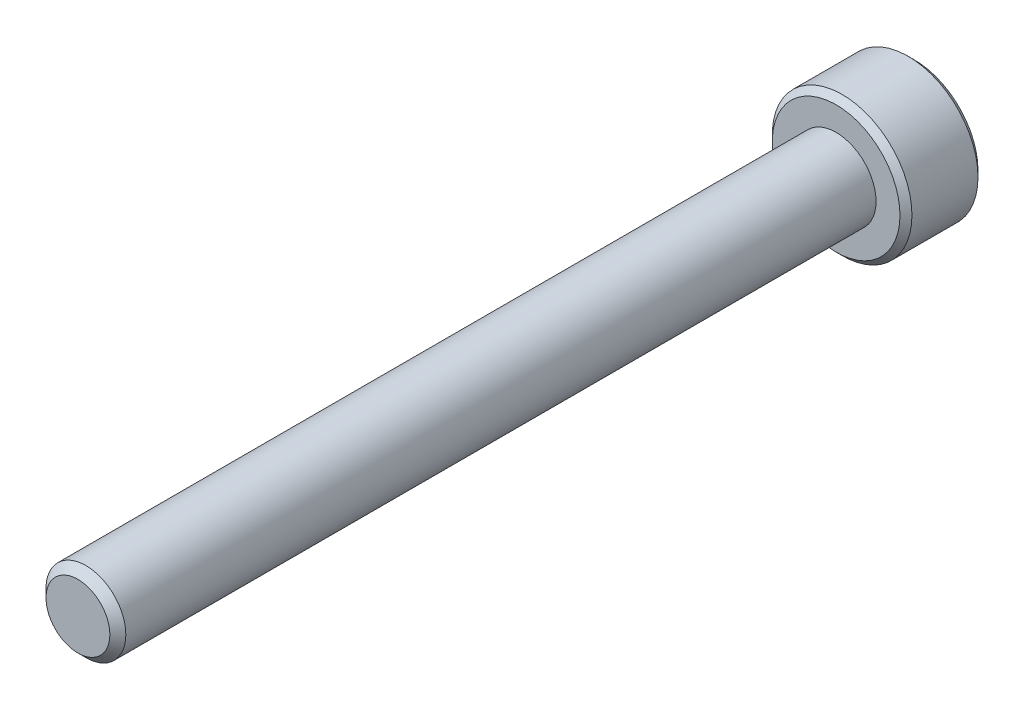
ISO-10303-21;
HEADER;
FILE_DESCRIPTION(('STEP AP214'),'2;1');
FILE_NAME('part.step','',(''),(''),'','','');
FILE_SCHEMA(('AUTOMOTIVE_DESIGN { 1 0 10303 214 1 1 1 1 }'));
ENDSEC;
DATA;
#1=APPLICATION_CONTEXT('core data for automotive mechanical design processes');
#2=APPLICATION_PROTOCOL_DEFINITION('international standard','automotive_design',2000,#1);
#3=PRODUCT_CONTEXT('',#1,'mechanical');
#4=PRODUCT('Part','Part','',(#3));
#5=PRODUCT_RELATED_PRODUCT_CATEGORY('part','',(#4));
#6=PRODUCT_DEFINITION_FORMATION('','',#4);
#7=PRODUCT_DEFINITION_CONTEXT('part definition',#1,'design');
#8=PRODUCT_DEFINITION('design','',#6,#7);
#9=PRODUCT_DEFINITION_SHAPE('','',#8);
#10=(LENGTH_UNIT() NAMED_UNIT(*) SI_UNIT(.MILLI.,.METRE.));
#11=(NAMED_UNIT(*) PLANE_ANGLE_UNIT() SI_UNIT($,.RADIAN.));
#12=(NAMED_UNIT(*) SI_UNIT($,.STERADIAN.) SOLID_ANGLE_UNIT());
#13=UNCERTAINTY_MEASURE_WITH_UNIT(LENGTH_MEASURE(1.E-05),#10,'distance_accuracy_value','');
#14=(GEOMETRIC_REPRESENTATION_CONTEXT(3) GLOBAL_UNCERTAINTY_ASSIGNED_CONTEXT((#13)) GLOBAL_UNIT_ASSIGNED_CONTEXT((#10,
#11,#12)) REPRESENTATION_CONTEXT('',''));
#15=CARTESIAN_POINT('',(0.,0.,0.));
#16=DIRECTION('',(0.,0.,1.));
#17=DIRECTION('',(1.,0.,0.));
#18=AXIS2_PLACEMENT_3D('',#15,#16,#17);
#19=CARTESIAN_POINT('',(0.,0.,3.91));
#20=DIRECTION('',(0.,0.,-1.));
#21=DIRECTION('',(-1.,0.,0.));
#22=AXIS2_PLACEMENT_3D('',#19,#20,#21);
#23=CYLINDRICAL_SURFACE('',#22,3.5);
#24=CARTESIAN_POINT('',(0.,0.,3.61));
#25=DIRECTION('',(0.,0.,1.));
#26=DIRECTION('',(1.,0.,0.));
#27=AXIS2_PLACEMENT_3D('',#24,#25,#26);
#28=CIRCLE('',#27,3.5);
#29=CARTESIAN_POINT('',(3.5,0.,3.61));
#30=VERTEX_POINT('',#29);
#31=EDGE_CURVE('E46',#30,#30,#28,.F.);
#32=ORIENTED_EDGE('',*,*,#31,.T.);
#33=EDGE_LOOP('',(#32));
#34=FACE_BOUND('',#33,.T.);
#35=CARTESIAN_POINT('',(0.,0.,0.299999999999997));
#36=DIRECTION('',(0.,0.,1.));
#37=DIRECTION('',(1.,0.,0.));
#38=AXIS2_PLACEMENT_3D('',#35,#36,#37);
#39=CIRCLE('',#38,3.5);
#40=CARTESIAN_POINT('',(3.5,0.,0.299999999999997));
#41=VERTEX_POINT('',#40);
#42=EDGE_CURVE('E157',#41,#41,#39,.T.);
#43=ORIENTED_EDGE('',*,*,#42,.T.);
#44=EDGE_LOOP('',(#43));
#45=FACE_BOUND('',#44,.T.);
#46=ADVANCED_FACE('F37',(#34,#45),#23,.T.);
#47=CARTESIAN_POINT('',(0.,0.,3.91));
#48=DIRECTION('',(0.,0.,1.));
#49=DIRECTION('',(1.,0.,0.));
#50=AXIS2_PLACEMENT_3D('',#47,#48,#49);
#51=PLANE('',#50);
#52=CARTESIAN_POINT('',(0.,0.,3.91));
#53=DIRECTION('',(0.,0.,1.));
#54=DIRECTION('',(1.,0.,0.));
#55=AXIS2_PLACEMENT_3D('',#52,#53,#54);
#56=CIRCLE('',#55,3.20000000000001);
#57=CARTESIAN_POINT('',(3.20000000000001,0.,3.91));
#58=VERTEX_POINT('',#57);
#59=EDGE_CURVE('E154',#58,#58,#56,.T.);
#60=ORIENTED_EDGE('',*,*,#59,.T.);
#61=EDGE_LOOP('',(#60));
#62=FACE_BOUND('',#61,.T.);
#63=CARTESIAN_POINT('',(0.,0.,3.91));
#64=DIRECTION('',(0.,0.,1.));
#65=DIRECTION('',(1.,0.,0.));
#66=AXIS2_PLACEMENT_3D('',#63,#64,#65);
#67=CIRCLE('',#66,2.);
#68=CARTESIAN_POINT('',(2.,0.,3.91));
#69=VERTEX_POINT('',#68);
#70=EDGE_CURVE('E140',#69,#69,#67,.T.);
#71=ORIENTED_EDGE('',*,*,#70,.F.);
#72=EDGE_LOOP('',(#71));
#73=FACE_BOUND('',#72,.T.);
#74=ADVANCED_FACE('F170',(#62,#73),#51,.T.);
#75=CARTESIAN_POINT('',(0.,0.,0.));
#76=DIRECTION('',(0.,0.,1.));
#77=DIRECTION('',(1.,0.,0.));
#78=AXIS2_PLACEMENT_3D('',#75,#76,#77);
#79=PLANE('',#78);
#80=CARTESIAN_POINT('',(0.,0.,0.));
#81=DIRECTION('',(0.,0.,1.));
#82=DIRECTION('',(1.,0.,0.));
#83=AXIS2_PLACEMENT_3D('',#80,#81,#82);
#84=CIRCLE('',#83,3.2);
#85=CARTESIAN_POINT('',(3.2,0.,0.));
#86=VERTEX_POINT('',#85);
#87=EDGE_CURVE('E11',#86,#86,#84,.F.);
#88=ORIENTED_EDGE('',*,*,#87,.T.);
#89=EDGE_LOOP('',(#88));
#90=FACE_BOUND('',#89,.T.);
#91=DIRECTION('',(0.866025403784439,-0.5,0.));
#92=VECTOR('',#91,1.);
#93=CARTESIAN_POINT('',(0.,1.76091832102836,0.));
#94=LINE('',#93,#92);
#95=CARTESIAN_POINT('',(0.,1.76091832102836,0.));
#96=VERTEX_POINT('',#95);
#97=CARTESIAN_POINT('',(1.525,0.88045916051418,0.));
#98=VERTEX_POINT('',#97);
#99=EDGE_CURVE('E127',#96,#98,#94,.T.);
#100=ORIENTED_EDGE('',*,*,#99,.F.);
#101=DIRECTION('',(0.866025403784439,0.5,0.));
#102=VECTOR('',#101,1.);
#103=CARTESIAN_POINT('',(-1.525,0.880459160514179,0.));
#104=LINE('',#103,#102);
#105=CARTESIAN_POINT('',(-1.525,0.880459160514179,0.));
#106=VERTEX_POINT('',#105);
#107=EDGE_CURVE('E53',#106,#96,#104,.T.);
#108=ORIENTED_EDGE('',*,*,#107,.F.);
#109=DIRECTION('',(0.,1.,0.));
#110=VECTOR('',#109,1.);
#111=CARTESIAN_POINT('',(-1.525,-0.88045916051418,0.));
#112=LINE('',#111,#110);
#113=CARTESIAN_POINT('',(-1.525,-0.88045916051418,0.));
#114=VERTEX_POINT('',#113);
#115=EDGE_CURVE('E136',#114,#106,#112,.T.);
#116=ORIENTED_EDGE('',*,*,#115,.F.);
#117=DIRECTION('',(-0.866025403784439,0.5,0.));
#118=VECTOR('',#117,1.);
#119=CARTESIAN_POINT('',(0.,-1.76091832102836,0.));
#120=LINE('',#119,#118);
#121=CARTESIAN_POINT('',(0.,-1.76091832102836,0.));
#122=VERTEX_POINT('',#121);
#123=EDGE_CURVE('E134',#122,#114,#120,.T.);
#124=ORIENTED_EDGE('',*,*,#123,.F.);
#125=DIRECTION('',(-0.866025403784438,-0.5,0.));
#126=VECTOR('',#125,1.);
#127=CARTESIAN_POINT('',(1.525,-0.880459160514179,0.));
#128=LINE('',#127,#126);
#129=CARTESIAN_POINT('',(1.525,-0.880459160514179,0.));
#130=VERTEX_POINT('',#129);
#131=EDGE_CURVE('E101',#130,#122,#128,.T.);
#132=ORIENTED_EDGE('',*,*,#131,.F.);
#133=DIRECTION('',(0.,-1.,0.));
#134=VECTOR('',#133,1.);
#135=CARTESIAN_POINT('',(1.525,0.88045916051418,0.));
#136=LINE('',#135,#134);
#137=EDGE_CURVE('E130',#98,#130,#136,.T.);
#138=ORIENTED_EDGE('',*,*,#137,.F.);
#139=EDGE_LOOP('',(#100,#108,#116,#124,#132,#138));
#140=FACE_BOUND('',#139,.T.);
#141=ADVANCED_FACE('F173',(#90,#140),#79,.F.);
#142=CARTESIAN_POINT('',(0.,0.,41.91));
#143=DIRECTION('',(0.,0.,-1.));
#144=DIRECTION('',(-1.,0.,0.));
#145=AXIS2_PLACEMENT_3D('',#142,#143,#144);
#146=CYLINDRICAL_SURFACE('',#145,2.);
#147=CARTESIAN_POINT('',(0.,0.,41.51));
#148=DIRECTION('',(0.,0.,1.));
#149=DIRECTION('',(1.,0.,0.));
#150=AXIS2_PLACEMENT_3D('',#147,#148,#149);
#151=CIRCLE('',#150,2.);
#152=CARTESIAN_POINT('',(2.,0.,41.51));
#153=VERTEX_POINT('',#152);
#154=EDGE_CURVE('E151',#153,#153,#151,.F.);
#155=ORIENTED_EDGE('',*,*,#154,.T.);
#156=EDGE_LOOP('',(#155));
#157=FACE_BOUND('',#156,.T.);
#158=ORIENTED_EDGE('',*,*,#70,.T.);
#159=EDGE_LOOP('',(#158));
#160=FACE_BOUND('',#159,.T.);
#161=ADVANCED_FACE('F177',(#157,#160),#146,.T.);
#162=CARTESIAN_POINT('',(0.,0.,41.91));
#163=DIRECTION('',(0.,0.,1.));
#164=DIRECTION('',(1.,0.,0.));
#165=AXIS2_PLACEMENT_3D('',#162,#163,#164);
#166=PLANE('',#165);
#167=CARTESIAN_POINT('',(0.,0.,41.91));
#168=DIRECTION('',(0.,0.,1.));
#169=DIRECTION('',(1.,0.,0.));
#170=AXIS2_PLACEMENT_3D('',#167,#168,#169);
#171=CIRCLE('',#170,1.6);
#172=CARTESIAN_POINT('',(1.6,0.,41.91));
#173=VERTEX_POINT('',#172);
#174=EDGE_CURVE('E148',#173,#173,#171,.T.);
#175=ORIENTED_EDGE('',*,*,#174,.T.);
#176=EDGE_LOOP('',(#175));
#177=FACE_BOUND('',#176,.T.);
#178=ADVANCED_FACE('F179',(#177),#166,.T.);
#179=CARTESIAN_POINT('',(-1.525,0.880459160514179,2.));
#180=DIRECTION('',(-0.5,0.866025403784439,0.));
#181=DIRECTION('',(-0.866025403784439,-0.5,0.));
#182=AXIS2_PLACEMENT_3D('',#179,#180,#181);
#183=PLANE('',#182);
#184=ORIENTED_EDGE('',*,*,#107,.T.);
#185=DIRECTION('',(0.,0.,-1.));
#186=VECTOR('',#185,1.);
#187=CARTESIAN_POINT('',(0.,1.76091832102836,2.));
#188=LINE('',#187,#186);
#189=CARTESIAN_POINT('',(0.,1.76091832102836,2.));
#190=VERTEX_POINT('',#189);
#191=EDGE_CURVE('E83',#190,#96,#188,.T.);
#192=ORIENTED_EDGE('',*,*,#191,.F.);
#193=DIRECTION('',(0.866025403784439,0.5,0.));
#194=VECTOR('',#193,1.);
#195=CARTESIAN_POINT('',(-1.525,0.880459160514179,2.));
#196=LINE('',#195,#194);
#197=CARTESIAN_POINT('',(-1.525,0.880459160514179,2.));
#198=VERTEX_POINT('',#197);
#199=EDGE_CURVE('E138',#198,#190,#196,.T.);
#200=ORIENTED_EDGE('',*,*,#199,.F.);
#201=DIRECTION('',(0.,0.,-1.));
#202=VECTOR('',#201,1.);
#203=CARTESIAN_POINT('',(-1.525,0.880459160514179,2.));
#204=LINE('',#203,#202);
#205=EDGE_CURVE('E61',#198,#106,#204,.T.);
#206=ORIENTED_EDGE('',*,*,#205,.T.);
#207=EDGE_LOOP('',(#184,#192,#200,#206));
#208=FACE_BOUND('',#207,.T.);
#209=ADVANCED_FACE('F186',(#208),#183,.F.);
#210=CARTESIAN_POINT('',(-1.525,-0.88045916051418,2.));
#211=DIRECTION('',(-1.,0.,0.));
#212=DIRECTION('',(0.,0.,1.));
#213=AXIS2_PLACEMENT_3D('',#210,#211,#212);
#214=PLANE('',#213);
#215=ORIENTED_EDGE('',*,*,#115,.T.);
#216=ORIENTED_EDGE('',*,*,#205,.F.);
#217=DIRECTION('',(0.,1.,0.));
#218=VECTOR('',#217,1.);
#219=CARTESIAN_POINT('',(-1.525,-0.88045916051418,2.));
#220=LINE('',#219,#218);
#221=CARTESIAN_POINT('',(-1.525,-0.88045916051418,2.));
#222=VERTEX_POINT('',#221);
#223=EDGE_CURVE('E113',#222,#198,#220,.T.);
#224=ORIENTED_EDGE('',*,*,#223,.F.);
#225=DIRECTION('',(0.,0.,-1.));
#226=VECTOR('',#225,1.);
#227=CARTESIAN_POINT('',(-1.525,-0.88045916051418,2.));
#228=LINE('',#227,#226);
#229=EDGE_CURVE('E105',#222,#114,#228,.T.);
#230=ORIENTED_EDGE('',*,*,#229,.T.);
#231=EDGE_LOOP('',(#215,#216,#224,#230));
#232=FACE_BOUND('',#231,.T.);
#233=ADVANCED_FACE('F221',(#232),#214,.F.);
#234=CARTESIAN_POINT('',(0.,-1.76091832102836,2.));
#235=DIRECTION('',(-0.5,-0.866025403784439,0.));
#236=DIRECTION('',(0.866025403784439,-0.5,0.));
#237=AXIS2_PLACEMENT_3D('',#234,#235,#236);
#238=PLANE('',#237);
#239=ORIENTED_EDGE('',*,*,#123,.T.);
#240=ORIENTED_EDGE('',*,*,#229,.F.);
#241=DIRECTION('',(-0.866025403784439,0.5,0.));
#242=VECTOR('',#241,1.);
#243=CARTESIAN_POINT('',(0.,-1.76091832102836,2.));
#244=LINE('',#243,#242);
#245=CARTESIAN_POINT('',(0.,-1.76091832102836,2.));
#246=VERTEX_POINT('',#245);
#247=EDGE_CURVE('E109',#246,#222,#244,.T.);
#248=ORIENTED_EDGE('',*,*,#247,.F.);
#249=DIRECTION('',(0.,0.,-1.));
#250=VECTOR('',#249,1.);
#251=CARTESIAN_POINT('',(0.,-1.76091832102836,2.));
#252=LINE('',#251,#250);
#253=EDGE_CURVE('E94',#246,#122,#252,.T.);
#254=ORIENTED_EDGE('',*,*,#253,.T.);
#255=EDGE_LOOP('',(#239,#240,#248,#254));
#256=FACE_BOUND('',#255,.T.);
#257=ADVANCED_FACE('F110',(#256),#238,.F.);
#258=CARTESIAN_POINT('',(1.525,-0.880459160514179,2.));
#259=DIRECTION('',(0.5,-0.866025403784439,0.));
#260=DIRECTION('',(0.866025403784438,0.5,0.));
#261=AXIS2_PLACEMENT_3D('',#258,#259,#260);
#262=PLANE('',#261);
#263=ORIENTED_EDGE('',*,*,#131,.T.);
#264=ORIENTED_EDGE('',*,*,#253,.F.);
#265=DIRECTION('',(-0.866025403784438,-0.5,0.));
#266=VECTOR('',#265,1.);
#267=CARTESIAN_POINT('',(1.525,-0.880459160514179,2.));
#268=LINE('',#267,#266);
#269=CARTESIAN_POINT('',(1.525,-0.880459160514179,2.));
#270=VERTEX_POINT('',#269);
#271=EDGE_CURVE('E98',#270,#246,#268,.T.);
#272=ORIENTED_EDGE('',*,*,#271,.F.);
#273=DIRECTION('',(0.,0.,-1.));
#274=VECTOR('',#273,1.);
#275=CARTESIAN_POINT('',(1.525,-0.880459160514179,2.));
#276=LINE('',#275,#274);
#277=EDGE_CURVE('E106',#270,#130,#276,.T.);
#278=ORIENTED_EDGE('',*,*,#277,.T.);
#279=EDGE_LOOP('',(#263,#264,#272,#278));
#280=FACE_BOUND('',#279,.T.);
#281=ADVANCED_FACE('F96',(#280),#262,.F.);
#282=CARTESIAN_POINT('',(1.525,0.88045916051418,2.));
#283=DIRECTION('',(1.,0.,0.));
#284=DIRECTION('',(0.,0.,-1.));
#285=AXIS2_PLACEMENT_3D('',#282,#283,#284);
#286=PLANE('',#285);
#287=ORIENTED_EDGE('',*,*,#137,.T.);
#288=ORIENTED_EDGE('',*,*,#277,.F.);
#289=DIRECTION('',(0.,-1.,0.));
#290=VECTOR('',#289,1.);
#291=CARTESIAN_POINT('',(1.525,0.88045916051418,2.));
#292=LINE('',#291,#290);
#293=CARTESIAN_POINT('',(1.525,0.88045916051418,2.));
#294=VERTEX_POINT('',#293);
#295=EDGE_CURVE('E119',#294,#270,#292,.T.);
#296=ORIENTED_EDGE('',*,*,#295,.F.);
#297=DIRECTION('',(0.,0.,-1.));
#298=VECTOR('',#297,1.);
#299=CARTESIAN_POINT('',(1.525,0.88045916051418,2.));
#300=LINE('',#299,#298);
#301=EDGE_CURVE('E143',#294,#98,#300,.T.);
#302=ORIENTED_EDGE('',*,*,#301,.T.);
#303=EDGE_LOOP('',(#287,#288,#296,#302));
#304=FACE_BOUND('',#303,.T.);
#305=ADVANCED_FACE('F217',(#304),#286,.F.);
#306=CARTESIAN_POINT('',(0.,1.76091832102836,2.));
#307=DIRECTION('',(0.5,0.866025403784439,0.));
#308=DIRECTION('',(-0.866025403784439,0.5,0.));
#309=AXIS2_PLACEMENT_3D('',#306,#307,#308);
#310=PLANE('',#309);
#311=ORIENTED_EDGE('',*,*,#99,.T.);
#312=ORIENTED_EDGE('',*,*,#301,.F.);
#313=DIRECTION('',(0.866025403784439,-0.5,0.));
#314=VECTOR('',#313,1.);
#315=CARTESIAN_POINT('',(0.,1.76091832102836,2.));
#316=LINE('',#315,#314);
#317=EDGE_CURVE('E121',#190,#294,#316,.T.);
#318=ORIENTED_EDGE('',*,*,#317,.F.);
#319=ORIENTED_EDGE('',*,*,#191,.T.);
#320=EDGE_LOOP('',(#311,#312,#318,#319));
#321=FACE_BOUND('',#320,.T.);
#322=ADVANCED_FACE('F209',(#321),#310,.F.);
#323=CARTESIAN_POINT('',(0.,0.,2.));
#324=DIRECTION('',(0.,0.,-1.));
#325=DIRECTION('',(-1.,0.,0.));
#326=AXIS2_PLACEMENT_3D('',#323,#324,#325);
#327=PLANE('',#326);
#328=ORIENTED_EDGE('',*,*,#199,.T.);
#329=ORIENTED_EDGE('',*,*,#317,.T.);
#330=ORIENTED_EDGE('',*,*,#295,.T.);
#331=ORIENTED_EDGE('',*,*,#271,.T.);
#332=ORIENTED_EDGE('',*,*,#247,.T.);
#333=ORIENTED_EDGE('',*,*,#223,.T.);
#334=EDGE_LOOP('',(#328,#329,#330,#331,#332,#333));
#335=FACE_BOUND('',#334,.T.);
#336=ADVANCED_FACE('F116',(#335),#327,.T.);
#337=CARTESIAN_POINT('',(0.,0.,41.91));
#338=DIRECTION('',(0.,0.,-1.));
#339=DIRECTION('',(-1.,0.,0.));
#340=AXIS2_PLACEMENT_3D('',#337,#338,#339);
#341=CONICAL_SURFACE('',#340,1.6,0.785398163397446);
#342=ORIENTED_EDGE('',*,*,#154,.F.);
#343=EDGE_LOOP('',(#342));
#344=FACE_BOUND('',#343,.T.);
#345=ORIENTED_EDGE('',*,*,#174,.F.);
#346=EDGE_LOOP('',(#345));
#347=FACE_BOUND('',#346,.T.);
#348=ADVANCED_FACE('F167',(#344,#347),#341,.T.);
#349=CARTESIAN_POINT('',(0.,0.,3.91));
#350=DIRECTION('',(0.,0.,-1.));
#351=DIRECTION('',(-1.,0.,0.));
#352=AXIS2_PLACEMENT_3D('',#349,#350,#351);
#353=CONICAL_SURFACE('',#352,3.20000000000001,0.785398163397441);
#354=ORIENTED_EDGE('',*,*,#31,.F.);
#355=EDGE_LOOP('',(#354));
#356=FACE_BOUND('',#355,.T.);
#357=ORIENTED_EDGE('',*,*,#59,.F.);
#358=EDGE_LOOP('',(#357));
#359=FACE_BOUND('',#358,.T.);
#360=ADVANCED_FACE('F164',(#356,#359),#353,.T.);
#361=CARTESIAN_POINT('',(0.,0.,0.299999999999997));
#362=DIRECTION('',(0.,0.,1.));
#363=DIRECTION('',(1.,0.,0.));
#364=AXIS2_PLACEMENT_3D('',#361,#362,#363);
#365=CONICAL_SURFACE('',#364,3.5,0.785398163397451);
#366=ORIENTED_EDGE('',*,*,#87,.F.);
#367=EDGE_LOOP('',(#366));
#368=FACE_BOUND('',#367,.T.);
#369=ORIENTED_EDGE('',*,*,#42,.F.);
#370=EDGE_LOOP('',(#369));
#371=FACE_BOUND('',#370,.T.);
#372=ADVANCED_FACE('F40',(#368,#371),#365,.T.);
#373=CLOSED_SHELL('',(#46,#74,#141,#161,#178,#209,#233,#257,#281,#305,#322,#336,#348,#360,#372));
#374=MANIFOLD_SOLID_BREP('B2',#373);
#375=ADVANCED_BREP_SHAPE_REPRESENTATION('',(#18,#374),#14);
#376=SHAPE_DEFINITION_REPRESENTATION(#9,#375);
ENDSEC;
END-ISO-10303-21;
